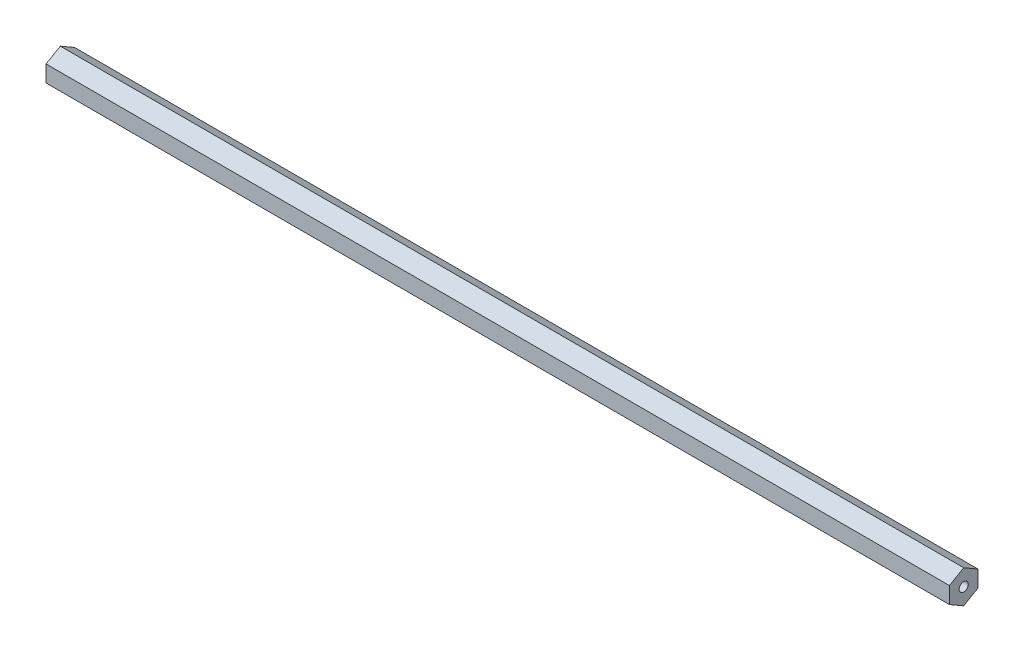
ISO-10303-21;
HEADER;
FILE_DESCRIPTION(('STEP AP214'),'2;1');
FILE_NAME('part.step','',(''),(''),'','','');
FILE_SCHEMA(('AUTOMOTIVE_DESIGN { 1 0 10303 214 1 1 1 1 }'));
ENDSEC;
DATA;
#1=APPLICATION_CONTEXT('core data for automotive mechanical design processes');
#2=APPLICATION_PROTOCOL_DEFINITION('international standard','automotive_design',2000,#1);
#3=PRODUCT_CONTEXT('',#1,'mechanical');
#4=PRODUCT('Part','Part','',(#3));
#5=PRODUCT_RELATED_PRODUCT_CATEGORY('part','',(#4));
#6=PRODUCT_DEFINITION_FORMATION('','',#4);
#7=PRODUCT_DEFINITION_CONTEXT('part definition',#1,'design');
#8=PRODUCT_DEFINITION('design','',#6,#7);
#9=PRODUCT_DEFINITION_SHAPE('','',#8);
#10=(LENGTH_UNIT() NAMED_UNIT(*) SI_UNIT(.MILLI.,.METRE.));
#11=(NAMED_UNIT(*) PLANE_ANGLE_UNIT() SI_UNIT($,.RADIAN.));
#12=(NAMED_UNIT(*) SI_UNIT($,.STERADIAN.) SOLID_ANGLE_UNIT());
#13=UNCERTAINTY_MEASURE_WITH_UNIT(LENGTH_MEASURE(1.E-05),#10,'distance_accuracy_value','');
#14=(GEOMETRIC_REPRESENTATION_CONTEXT(3) GLOBAL_UNCERTAINTY_ASSIGNED_CONTEXT((#13)) GLOBAL_UNIT_ASSIGNED_CONTEXT((#10,
#11,#12)) REPRESENTATION_CONTEXT('',''));
#15=CARTESIAN_POINT('',(0.,0.,0.));
#16=DIRECTION('',(0.,0.,1.));
#17=DIRECTION('',(1.,0.,0.));
#18=AXIS2_PLACEMENT_3D('',#15,#16,#17);
#19=CARTESIAN_POINT('',(200.81875,0.,-6.35));
#20=DIRECTION('',(0.,0.,1.));
#21=DIRECTION('',(0.,-1.,0.));
#22=AXIS2_PLACEMENT_3D('',#19,#20,#21);
#23=PLANE('',#22);
#24=DIRECTION('',(0.,1.,0.));
#25=VECTOR('',#24,1.);
#26=CARTESIAN_POINT('',(-200.81875,0.,-6.35));
#27=LINE('',#26,#25);
#28=CARTESIAN_POINT('',(-200.81875,-3.66617420935412,-6.35));
#29=VERTEX_POINT('',#28);
#30=CARTESIAN_POINT('',(-200.81875,3.66617420935413,-6.35));
#31=VERTEX_POINT('',#30);
#32=EDGE_CURVE('E130',#29,#31,#27,.T.);
#33=ORIENTED_EDGE('',*,*,#32,.T.);
#34=DIRECTION('',(-1.,0.,0.));
#35=VECTOR('',#34,1.);
#36=CARTESIAN_POINT('',(200.81875,3.66617420935413,-6.35));
#37=LINE('',#36,#35);
#38=CARTESIAN_POINT('',(200.81875,3.66617420935413,-6.35));
#39=VERTEX_POINT('',#38);
#40=EDGE_CURVE('E11',#39,#31,#37,.T.);
#41=ORIENTED_EDGE('',*,*,#40,.F.);
#42=DIRECTION('',(0.,1.,0.));
#43=VECTOR('',#42,1.);
#44=CARTESIAN_POINT('',(200.81875,0.,-6.35));
#45=LINE('',#44,#43);
#46=CARTESIAN_POINT('',(200.81875,-3.66617420935412,-6.35));
#47=VERTEX_POINT('',#46);
#48=EDGE_CURVE('E141',#47,#39,#45,.T.);
#49=ORIENTED_EDGE('',*,*,#48,.F.);
#50=DIRECTION('',(-1.,0.,0.));
#51=VECTOR('',#50,1.);
#52=CARTESIAN_POINT('',(200.81875,-3.66617420935412,-6.35));
#53=LINE('',#52,#51);
#54=EDGE_CURVE('E126',#47,#29,#53,.T.);
#55=ORIENTED_EDGE('',*,*,#54,.T.);
#56=EDGE_LOOP('',(#33,#41,#49,#55));
#57=FACE_BOUND('',#56,.T.);
#58=ADVANCED_FACE('F43',(#57),#23,.F.);
#59=CARTESIAN_POINT('',(200.81875,5.49926131403119,-3.175));
#60=DIRECTION('',(0.,-0.866025403784439,0.5));
#61=DIRECTION('',(0.,-0.5,-0.866025403784439));
#62=AXIS2_PLACEMENT_3D('',#59,#60,#61);
#63=PLANE('',#62);
#64=DIRECTION('',(0.,0.5,0.866025403784439));
#65=VECTOR('',#64,1.);
#66=CARTESIAN_POINT('',(-200.81875,5.49926131403119,-3.175));
#67=LINE('',#66,#65);
#68=CARTESIAN_POINT('',(-200.81875,7.33234841870825,0.));
#69=VERTEX_POINT('',#68);
#70=EDGE_CURVE('E133',#31,#69,#67,.T.);
#71=ORIENTED_EDGE('',*,*,#70,.T.);
#72=DIRECTION('',(-1.,0.,0.));
#73=VECTOR('',#72,1.);
#74=CARTESIAN_POINT('',(200.81875,7.33234841870825,0.));
#75=LINE('',#74,#73);
#76=CARTESIAN_POINT('',(200.81875,7.33234841870825,0.));
#77=VERTEX_POINT('',#76);
#78=EDGE_CURVE('E51',#77,#69,#75,.T.);
#79=ORIENTED_EDGE('',*,*,#78,.F.);
#80=DIRECTION('',(0.,0.5,0.866025403784439));
#81=VECTOR('',#80,1.);
#82=CARTESIAN_POINT('',(200.81875,5.49926131403119,-3.175));
#83=LINE('',#82,#81);
#84=EDGE_CURVE('E97',#39,#77,#83,.T.);
#85=ORIENTED_EDGE('',*,*,#84,.F.);
#86=ORIENTED_EDGE('',*,*,#40,.T.);
#87=EDGE_LOOP('',(#71,#79,#85,#86));
#88=FACE_BOUND('',#87,.T.);
#89=ADVANCED_FACE('F166',(#88),#63,.F.);
#90=CARTESIAN_POINT('',(200.81875,5.49926131403118,3.175));
#91=DIRECTION('',(0.,-0.866025403784438,-0.5));
#92=DIRECTION('',(0.,0.5,-0.866025403784439));
#93=AXIS2_PLACEMENT_3D('',#90,#91,#92);
#94=PLANE('',#93);
#95=DIRECTION('',(0.,-0.5,0.866025403784439));
#96=VECTOR('',#95,1.);
#97=CARTESIAN_POINT('',(-200.81875,5.49926131403118,3.175));
#98=LINE('',#97,#96);
#99=CARTESIAN_POINT('',(-200.81875,3.66617420935412,6.35));
#100=VERTEX_POINT('',#99);
#101=EDGE_CURVE('E136',#69,#100,#98,.T.);
#102=ORIENTED_EDGE('',*,*,#101,.T.);
#103=DIRECTION('',(-1.,0.,0.));
#104=VECTOR('',#103,1.);
#105=CARTESIAN_POINT('',(200.81875,3.66617420935412,6.35));
#106=LINE('',#105,#104);
#107=CARTESIAN_POINT('',(200.81875,3.66617420935412,6.35));
#108=VERTEX_POINT('',#107);
#109=EDGE_CURVE('E121',#108,#100,#106,.T.);
#110=ORIENTED_EDGE('',*,*,#109,.F.);
#111=DIRECTION('',(0.,-0.5,0.866025403784439));
#112=VECTOR('',#111,1.);
#113=CARTESIAN_POINT('',(200.81875,5.49926131403118,3.175));
#114=LINE('',#113,#112);
#115=EDGE_CURVE('E112',#77,#108,#114,.T.);
#116=ORIENTED_EDGE('',*,*,#115,.F.);
#117=ORIENTED_EDGE('',*,*,#78,.T.);
#118=EDGE_LOOP('',(#102,#110,#116,#117));
#119=FACE_BOUND('',#118,.T.);
#120=ADVANCED_FACE('F147',(#119),#94,.F.);
#121=CARTESIAN_POINT('',(200.81875,0.,6.35));
#122=DIRECTION('',(0.,0.,-1.));
#123=DIRECTION('',(0.,1.,0.));
#124=AXIS2_PLACEMENT_3D('',#121,#122,#123);
#125=PLANE('',#124);
#126=DIRECTION('',(0.,-1.,0.));
#127=VECTOR('',#126,1.);
#128=CARTESIAN_POINT('',(-200.81875,0.,6.35));
#129=LINE('',#128,#127);
#130=CARTESIAN_POINT('',(-200.81875,-3.66617420935413,6.35));
#131=VERTEX_POINT('',#130);
#132=EDGE_CURVE('E120',#100,#131,#129,.T.);
#133=ORIENTED_EDGE('',*,*,#132,.T.);
#134=DIRECTION('',(-1.,0.,0.));
#135=VECTOR('',#134,1.);
#136=CARTESIAN_POINT('',(200.81875,-3.66617420935413,6.35));
#137=LINE('',#136,#135);
#138=CARTESIAN_POINT('',(200.81875,-3.66617420935413,6.35));
#139=VERTEX_POINT('',#138);
#140=EDGE_CURVE('E117',#139,#131,#137,.T.);
#141=ORIENTED_EDGE('',*,*,#140,.F.);
#142=DIRECTION('',(0.,-1.,0.));
#143=VECTOR('',#142,1.);
#144=CARTESIAN_POINT('',(200.81875,0.,6.35));
#145=LINE('',#144,#143);
#146=EDGE_CURVE('E106',#108,#139,#145,.T.);
#147=ORIENTED_EDGE('',*,*,#146,.F.);
#148=ORIENTED_EDGE('',*,*,#109,.T.);
#149=EDGE_LOOP('',(#133,#141,#147,#148));
#150=FACE_BOUND('',#149,.T.);
#151=ADVANCED_FACE('F118',(#150),#125,.F.);
#152=CARTESIAN_POINT('',(200.81875,-5.49926131403119,3.175));
#153=DIRECTION('',(0.,0.866025403784439,-0.5));
#154=DIRECTION('',(0.,0.5,0.866025403784439));
#155=AXIS2_PLACEMENT_3D('',#152,#153,#154);
#156=PLANE('',#155);
#157=DIRECTION('',(0.,-0.5,-0.866025403784439));
#158=VECTOR('',#157,1.);
#159=CARTESIAN_POINT('',(-200.81875,-5.49926131403119,3.175));
#160=LINE('',#159,#158);
#161=CARTESIAN_POINT('',(-200.81875,-7.33234841870825,0.));
#162=VERTEX_POINT('',#161);
#163=EDGE_CURVE('E83',#131,#162,#160,.T.);
#164=ORIENTED_EDGE('',*,*,#163,.T.);
#165=DIRECTION('',(-1.,0.,0.));
#166=VECTOR('',#165,1.);
#167=CARTESIAN_POINT('',(200.81875,-7.33234841870825,0.));
#168=LINE('',#167,#166);
#169=CARTESIAN_POINT('',(200.81875,-7.33234841870825,0.));
#170=VERTEX_POINT('',#169);
#171=EDGE_CURVE('E122',#170,#162,#168,.T.);
#172=ORIENTED_EDGE('',*,*,#171,.F.);
#173=DIRECTION('',(0.,-0.5,-0.866025403784439));
#174=VECTOR('',#173,1.);
#175=CARTESIAN_POINT('',(200.81875,-5.49926131403119,3.175));
#176=LINE('',#175,#174);
#177=EDGE_CURVE('E110',#139,#170,#176,.T.);
#178=ORIENTED_EDGE('',*,*,#177,.F.);
#179=ORIENTED_EDGE('',*,*,#140,.T.);
#180=EDGE_LOOP('',(#164,#172,#178,#179));
#181=FACE_BOUND('',#180,.T.);
#182=ADVANCED_FACE('F124',(#181),#156,.F.);
#183=CARTESIAN_POINT('',(200.81875,-5.49926131403118,-3.175));
#184=DIRECTION('',(0.,0.866025403784439,0.5));
#185=DIRECTION('',(0.,-0.5,0.866025403784439));
#186=AXIS2_PLACEMENT_3D('',#183,#184,#185);
#187=PLANE('',#186);
#188=DIRECTION('',(0.,0.5,-0.866025403784439));
#189=VECTOR('',#188,1.);
#190=CARTESIAN_POINT('',(-200.81875,-5.49926131403118,-3.175));
#191=LINE('',#190,#189);
#192=EDGE_CURVE('E89',#162,#29,#191,.T.);
#193=ORIENTED_EDGE('',*,*,#192,.T.);
#194=ORIENTED_EDGE('',*,*,#54,.F.);
#195=DIRECTION('',(0.,0.5,-0.866025403784439));
#196=VECTOR('',#195,1.);
#197=CARTESIAN_POINT('',(200.81875,-5.49926131403118,-3.175));
#198=LINE('',#197,#196);
#199=EDGE_CURVE('E59',#170,#47,#198,.T.);
#200=ORIENTED_EDGE('',*,*,#199,.F.);
#201=ORIENTED_EDGE('',*,*,#171,.T.);
#202=EDGE_LOOP('',(#193,#194,#200,#201));
#203=FACE_BOUND('',#202,.T.);
#204=ADVANCED_FACE('F154',(#203),#187,.F.);
#205=CARTESIAN_POINT('',(200.81875,0.,0.));
#206=DIRECTION('',(1.,0.,0.));
#207=DIRECTION('',(0.,0.,-1.));
#208=AXIS2_PLACEMENT_3D('',#205,#206,#207);
#209=PLANE('',#208);
#210=CARTESIAN_POINT('',(200.81875,0.,0.));
#211=DIRECTION('',(1.,0.,0.));
#212=DIRECTION('',(0.,0.,-1.));
#213=AXIS2_PLACEMENT_3D('',#210,#211,#212);
#214=CIRCLE('',#213,2.01929999999999);
#215=CARTESIAN_POINT('',(200.81875,0.,-2.01929999999999));
#216=VERTEX_POINT('',#215);
#217=EDGE_CURVE('E300',#216,#216,#214,.T.);
#218=ORIENTED_EDGE('',*,*,#217,.F.);
#219=EDGE_LOOP('',(#218));
#220=FACE_BOUND('',#219,.T.);
#221=ORIENTED_EDGE('',*,*,#48,.T.);
#222=ORIENTED_EDGE('',*,*,#84,.T.);
#223=ORIENTED_EDGE('',*,*,#115,.T.);
#224=ORIENTED_EDGE('',*,*,#146,.T.);
#225=ORIENTED_EDGE('',*,*,#177,.T.);
#226=ORIENTED_EDGE('',*,*,#199,.T.);
#227=EDGE_LOOP('',(#221,#222,#223,#224,#225,#226));
#228=FACE_BOUND('',#227,.T.);
#229=ADVANCED_FACE('F108',(#220,#228),#209,.T.);
#230=CARTESIAN_POINT('',(-200.81875,0.,0.));
#231=DIRECTION('',(1.,0.,0.));
#232=DIRECTION('',(0.,0.,-1.));
#233=AXIS2_PLACEMENT_3D('',#230,#231,#232);
#234=PLANE('',#233);
#235=CARTESIAN_POINT('',(-200.81875,0.,0.));
#236=DIRECTION('',(-1.,0.,0.));
#237=DIRECTION('',(0.,0.,1.));
#238=AXIS2_PLACEMENT_3D('',#235,#236,#237);
#239=CIRCLE('',#238,2.01929999999999);
#240=CARTESIAN_POINT('',(-200.81875,0.,2.01929999999999));
#241=VERTEX_POINT('',#240);
#242=EDGE_CURVE('E302',#241,#241,#239,.T.);
#243=ORIENTED_EDGE('',*,*,#242,.F.);
#244=EDGE_LOOP('',(#243));
#245=FACE_BOUND('',#244,.T.);
#246=ORIENTED_EDGE('',*,*,#32,.F.);
#247=ORIENTED_EDGE('',*,*,#192,.F.);
#248=ORIENTED_EDGE('',*,*,#163,.F.);
#249=ORIENTED_EDGE('',*,*,#132,.F.);
#250=ORIENTED_EDGE('',*,*,#101,.F.);
#251=ORIENTED_EDGE('',*,*,#70,.F.);
#252=EDGE_LOOP('',(#246,#247,#248,#249,#250,#251));
#253=FACE_BOUND('',#252,.T.);
#254=ADVANCED_FACE('F150',(#245,#253),#234,.F.);
#255=CARTESIAN_POINT('',(-184.47131,0.,0.));
#256=DIRECTION('',(-1.,0.,0.));
#257=DIRECTION('',(0.,0.,1.));
#258=AXIS2_PLACEMENT_3D('',#255,#256,#257);
#259=CONICAL_SURFACE('',#258,2.01929999999999,1.02974425867665);
#260=CARTESIAN_POINT('',(-183.257992151998,0.,0.));
#261=VERTEX_POINT('',#260);
#262=VERTEX_LOOP('',#261);
#263=FACE_BOUND('',#262,.T.);
#264=CARTESIAN_POINT('',(-184.47131,0.,0.));
#265=DIRECTION('',(-1.,0.,0.));
#266=DIRECTION('',(0.,0.,1.));
#267=AXIS2_PLACEMENT_3D('',#264,#265,#266);
#268=CIRCLE('',#267,2.01929999999999);
#269=CARTESIAN_POINT('',(-184.47131,0.,2.01929999999999));
#270=VERTEX_POINT('',#269);
#271=EDGE_CURVE('E134',#270,#270,#268,.T.);
#272=ORIENTED_EDGE('',*,*,#271,.T.);
#273=EDGE_LOOP('',(#272));
#274=FACE_BOUND('',#273,.T.);
#275=ADVANCED_FACE('F210',(#263,#274),#259,.F.);
#276=CARTESIAN_POINT('',(-200.81875,0.,0.));
#277=DIRECTION('',(-1.,0.,0.));
#278=DIRECTION('',(0.,0.,1.));
#279=AXIS2_PLACEMENT_3D('',#276,#277,#278);
#280=CYLINDRICAL_SURFACE('',#279,2.01929999999999);
#281=ORIENTED_EDGE('',*,*,#271,.F.);
#282=EDGE_LOOP('',(#281));
#283=FACE_BOUND('',#282,.T.);
#284=ORIENTED_EDGE('',*,*,#242,.T.);
#285=EDGE_LOOP('',(#284));
#286=FACE_BOUND('',#285,.T.);
#287=ADVANCED_FACE('F222',(#283,#286),#280,.F.);
#288=CARTESIAN_POINT('',(184.47131,0.,0.));
#289=DIRECTION('',(1.,0.,0.));
#290=DIRECTION('',(0.,0.,-1.));
#291=AXIS2_PLACEMENT_3D('',#288,#289,#290);
#292=CONICAL_SURFACE('',#291,2.01929999999999,1.02974425867665);
#293=CARTESIAN_POINT('',(183.257992151998,0.,0.));
#294=VERTEX_POINT('',#293);
#295=VERTEX_LOOP('',#294);
#296=FACE_BOUND('',#295,.T.);
#297=CARTESIAN_POINT('',(184.47131,0.,0.));
#298=DIRECTION('',(1.,0.,0.));
#299=DIRECTION('',(0.,0.,-1.));
#300=AXIS2_PLACEMENT_3D('',#297,#298,#299);
#301=CIRCLE('',#300,2.01929999999999);
#302=CARTESIAN_POINT('',(184.47131,0.,-2.01929999999999));
#303=VERTEX_POINT('',#302);
#304=EDGE_CURVE('E297',#303,#303,#301,.T.);
#305=ORIENTED_EDGE('',*,*,#304,.T.);
#306=EDGE_LOOP('',(#305));
#307=FACE_BOUND('',#306,.T.);
#308=ADVANCED_FACE('F234',(#296,#307),#292,.F.);
#309=CARTESIAN_POINT('',(200.81875,0.,0.));
#310=DIRECTION('',(1.,0.,0.));
#311=DIRECTION('',(0.,0.,-1.));
#312=AXIS2_PLACEMENT_3D('',#309,#310,#311);
#313=CYLINDRICAL_SURFACE('',#312,2.01929999999999);
#314=ORIENTED_EDGE('',*,*,#304,.F.);
#315=EDGE_LOOP('',(#314));
#316=FACE_BOUND('',#315,.T.);
#317=ORIENTED_EDGE('',*,*,#217,.T.);
#318=EDGE_LOOP('',(#317));
#319=FACE_BOUND('',#318,.T.);
#320=ADVANCED_FACE('F246',(#316,#319),#313,.F.);
#321=CLOSED_SHELL('',(#58,#89,#120,#151,#182,#204,#229,#254,#275,#287,#308,#320));
#322=MANIFOLD_SOLID_BREP('B2',#321);
#323=ADVANCED_BREP_SHAPE_REPRESENTATION('',(#18,#322),#14);
#324=SHAPE_DEFINITION_REPRESENTATION(#9,#323);
ENDSEC;
END-ISO-10303-21;
